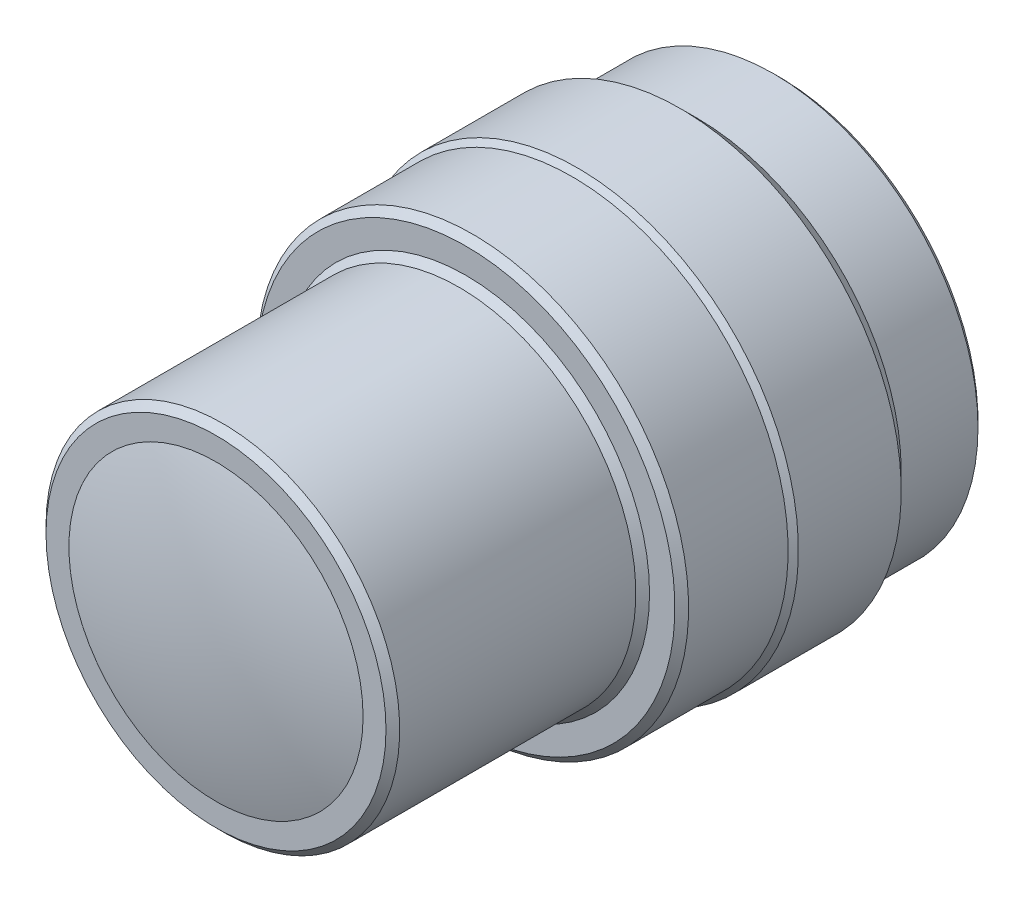
ISO-10303-21;
HEADER;
FILE_DESCRIPTION(('STEP AP214'),'2;1');
FILE_NAME('part.step','',(''),(''),'','','');
FILE_SCHEMA(('AUTOMOTIVE_DESIGN { 1 0 10303 214 1 1 1 1 }'));
ENDSEC;
DATA;
#1=APPLICATION_CONTEXT('core data for automotive mechanical design processes');
#2=APPLICATION_PROTOCOL_DEFINITION('international standard','automotive_design',2000,#1);
#3=PRODUCT_CONTEXT('',#1,'mechanical');
#4=PRODUCT('Part','Part','',(#3));
#5=PRODUCT_RELATED_PRODUCT_CATEGORY('part','',(#4));
#6=PRODUCT_DEFINITION_FORMATION('','',#4);
#7=PRODUCT_DEFINITION_CONTEXT('part definition',#1,'design');
#8=PRODUCT_DEFINITION('design','',#6,#7);
#9=PRODUCT_DEFINITION_SHAPE('','',#8);
#10=(LENGTH_UNIT() NAMED_UNIT(*) SI_UNIT(.MILLI.,.METRE.));
#11=(NAMED_UNIT(*) PLANE_ANGLE_UNIT() SI_UNIT($,.RADIAN.));
#12=(NAMED_UNIT(*) SI_UNIT($,.STERADIAN.) SOLID_ANGLE_UNIT());
#13=UNCERTAINTY_MEASURE_WITH_UNIT(LENGTH_MEASURE(1.E-05),#10,'distance_accuracy_value','');
#14=(GEOMETRIC_REPRESENTATION_CONTEXT(3) GLOBAL_UNCERTAINTY_ASSIGNED_CONTEXT((#13)) GLOBAL_UNIT_ASSIGNED_CONTEXT((#10,
#11,#12)) REPRESENTATION_CONTEXT('',''));
#15=CARTESIAN_POINT('',(0.,0.,0.));
#16=DIRECTION('',(0.,0.,1.));
#17=DIRECTION('',(1.,0.,0.));
#18=AXIS2_PLACEMENT_3D('',#15,#16,#17);
#19=CARTESIAN_POINT('',(0.,0.,0.));
#20=DIRECTION('',(0.,0.,1.));
#21=DIRECTION('',(1.,0.,0.));
#22=AXIS2_PLACEMENT_3D('',#19,#20,#21);
#23=PLANE('',#22);
#24=CARTESIAN_POINT('',(0.,0.,0.));
#25=DIRECTION('',(0.,0.,-1.));
#26=DIRECTION('',(-1.,0.,0.));
#27=AXIS2_PLACEMENT_3D('',#24,#25,#26);
#28=CIRCLE('',#27,12.7);
#29=CARTESIAN_POINT('',(-12.7,0.,0.));
#30=VERTEX_POINT('',#29);
#31=EDGE_CURVE('E10',#30,#30,#28,.T.);
#32=ORIENTED_EDGE('',*,*,#31,.T.);
#33=EDGE_LOOP('',(#32));
#34=FACE_BOUND('',#33,.T.);
#35=ADVANCED_FACE('F36',(#34),#23,.F.);
#36=CARTESIAN_POINT('',(0.,0.,0.));
#37=DIRECTION('',(0.,0.,-1.));
#38=DIRECTION('',(-1.,0.,0.));
#39=AXIS2_PLACEMENT_3D('',#36,#37,#38);
#40=CYLINDRICAL_SURFACE('',#39,12.7);
#41=ORIENTED_EDGE('',*,*,#31,.F.);
#42=EDGE_LOOP('',(#41));
#43=FACE_BOUND('',#42,.T.);
#44=CARTESIAN_POINT('',(0.,0.,3.));
#45=DIRECTION('',(0.,0.,-1.));
#46=DIRECTION('',(-1.,0.,0.));
#47=AXIS2_PLACEMENT_3D('',#44,#45,#46);
#48=CIRCLE('',#47,12.7);
#49=CARTESIAN_POINT('',(-12.7,0.,3.));
#50=VERTEX_POINT('',#49);
#51=EDGE_CURVE('E42',#50,#50,#48,.T.);
#52=ORIENTED_EDGE('',*,*,#51,.T.);
#53=EDGE_LOOP('',(#52));
#54=FACE_BOUND('',#53,.T.);
#55=ADVANCED_FACE('F116',(#43,#54),#40,.T.);
#56=CARTESIAN_POINT('',(12.7,0.,3.));
#57=DIRECTION('',(0.,0.,1.));
#58=DIRECTION('',(1.,0.,0.));
#59=AXIS2_PLACEMENT_3D('',#56,#57,#58);
#60=PLANE('',#59);
#61=ORIENTED_EDGE('',*,*,#51,.F.);
#62=EDGE_LOOP('',(#61));
#63=FACE_BOUND('',#62,.T.);
#64=CARTESIAN_POINT('',(0.,0.,3.));
#65=DIRECTION('',(0.,0.,-1.));
#66=DIRECTION('',(-1.,0.,0.));
#67=AXIS2_PLACEMENT_3D('',#64,#65,#66);
#68=CIRCLE('',#67,15.);
#69=CARTESIAN_POINT('',(-15.,0.,3.));
#70=VERTEX_POINT('',#69);
#71=EDGE_CURVE('E46',#70,#70,#68,.T.);
#72=ORIENTED_EDGE('',*,*,#71,.T.);
#73=EDGE_LOOP('',(#72));
#74=FACE_BOUND('',#73,.T.);
#75=ADVANCED_FACE('F120',(#63,#74),#60,.F.);
#76=CARTESIAN_POINT('',(0.,0.,0.));
#77=DIRECTION('',(0.,0.,-1.));
#78=DIRECTION('',(-1.,0.,0.));
#79=AXIS2_PLACEMENT_3D('',#76,#77,#78);
#80=CYLINDRICAL_SURFACE('',#79,15.);
#81=ORIENTED_EDGE('',*,*,#71,.F.);
#82=EDGE_LOOP('',(#81));
#83=FACE_BOUND('',#82,.T.);
#84=CARTESIAN_POINT('',(0.,0.,4.));
#85=DIRECTION('',(0.,0.,-1.));
#86=DIRECTION('',(-1.,0.,0.));
#87=AXIS2_PLACEMENT_3D('',#84,#85,#86);
#88=CIRCLE('',#87,15.);
#89=CARTESIAN_POINT('',(-15.,0.,4.));
#90=VERTEX_POINT('',#89);
#91=EDGE_CURVE('E50',#90,#90,#88,.T.);
#92=ORIENTED_EDGE('',*,*,#91,.T.);
#93=EDGE_LOOP('',(#92));
#94=FACE_BOUND('',#93,.T.);
#95=ADVANCED_FACE('F125',(#83,#94),#80,.T.);
#96=CARTESIAN_POINT('',(15.,0.,4.));
#97=DIRECTION('',(0.,0.,1.));
#98=DIRECTION('',(1.,0.,0.));
#99=AXIS2_PLACEMENT_3D('',#96,#97,#98);
#100=PLANE('',#99);
#101=ORIENTED_EDGE('',*,*,#91,.F.);
#102=EDGE_LOOP('',(#101));
#103=FACE_BOUND('',#102,.T.);
#104=CARTESIAN_POINT('',(0.,0.,4.));
#105=DIRECTION('',(0.,0.,-1.));
#106=DIRECTION('',(-1.,0.,0.));
#107=AXIS2_PLACEMENT_3D('',#104,#105,#106);
#108=CIRCLE('',#107,29.);
#109=CARTESIAN_POINT('',(-29.,0.,4.));
#110=VERTEX_POINT('',#109);
#111=EDGE_CURVE('E55',#110,#110,#108,.T.);
#112=ORIENTED_EDGE('',*,*,#111,.T.);
#113=EDGE_LOOP('',(#112));
#114=FACE_BOUND('',#113,.T.);
#115=ADVANCED_FACE('F131',(#103,#114),#100,.F.);
#116=CARTESIAN_POINT('',(0.,0.,4.8));
#117=DIRECTION('',(0.,0.,1.));
#118=DIRECTION('',(1.,0.,0.));
#119=AXIS2_PLACEMENT_3D('',#116,#117,#118);
#120=CONICAL_SURFACE('',#119,29.8,0.78539816339745);
#121=ORIENTED_EDGE('',*,*,#111,.F.);
#122=EDGE_LOOP('',(#121));
#123=FACE_BOUND('',#122,.T.);
#124=CARTESIAN_POINT('',(0.,0.,4.8));
#125=DIRECTION('',(0.,0.,-1.));
#126=DIRECTION('',(-1.,0.,0.));
#127=AXIS2_PLACEMENT_3D('',#124,#125,#126);
#128=CIRCLE('',#127,29.8);
#129=CARTESIAN_POINT('',(-29.8,0.,4.8));
#130=VERTEX_POINT('',#129);
#131=EDGE_CURVE('E58',#130,#130,#128,.T.);
#132=ORIENTED_EDGE('',*,*,#131,.T.);
#133=EDGE_LOOP('',(#132));
#134=FACE_BOUND('',#133,.T.);
#135=ADVANCED_FACE('F135',(#123,#134),#120,.T.);
#136=CARTESIAN_POINT('',(0.,0.,0.));
#137=DIRECTION('',(0.,0.,-1.));
#138=DIRECTION('',(-1.,0.,0.));
#139=AXIS2_PLACEMENT_3D('',#136,#137,#138);
#140=CYLINDRICAL_SURFACE('',#139,29.8);
#141=ORIENTED_EDGE('',*,*,#131,.F.);
#142=EDGE_LOOP('',(#141));
#143=FACE_BOUND('',#142,.T.);
#144=CARTESIAN_POINT('',(0.,0.,16.));
#145=DIRECTION('',(0.,0.,-1.));
#146=DIRECTION('',(-1.,0.,0.));
#147=AXIS2_PLACEMENT_3D('',#144,#145,#146);
#148=CIRCLE('',#147,29.8);
#149=CARTESIAN_POINT('',(-29.8,0.,16.));
#150=VERTEX_POINT('',#149);
#151=EDGE_CURVE('E61',#150,#150,#148,.T.);
#152=ORIENTED_EDGE('',*,*,#151,.T.);
#153=EDGE_LOOP('',(#152));
#154=FACE_BOUND('',#153,.T.);
#155=ADVANCED_FACE('F139',(#143,#154),#140,.T.);
#156=CARTESIAN_POINT('',(0.,0.,18.45));
#157=DIRECTION('',(0.,0.,1.));
#158=DIRECTION('',(1.,0.,0.));
#159=AXIS2_PLACEMENT_3D('',#156,#157,#158);
#160=CONICAL_SURFACE('',#159,32.25,0.78539816339745);
#161=ORIENTED_EDGE('',*,*,#151,.F.);
#162=EDGE_LOOP('',(#161));
#163=FACE_BOUND('',#162,.T.);
#164=CARTESIAN_POINT('',(0.,0.,18.45));
#165=DIRECTION('',(0.,0.,-1.));
#166=DIRECTION('',(-1.,0.,0.));
#167=AXIS2_PLACEMENT_3D('',#164,#165,#166);
#168=CIRCLE('',#167,32.25);
#169=CARTESIAN_POINT('',(-32.25,0.,18.45));
#170=VERTEX_POINT('',#169);
#171=EDGE_CURVE('E64',#170,#170,#168,.T.);
#172=ORIENTED_EDGE('',*,*,#171,.T.);
#173=EDGE_LOOP('',(#172));
#174=FACE_BOUND('',#173,.T.);
#175=ADVANCED_FACE('F143',(#163,#174),#160,.T.);
#176=CARTESIAN_POINT('',(0.,0.,0.));
#177=DIRECTION('',(0.,0.,-1.));
#178=DIRECTION('',(-1.,0.,0.));
#179=AXIS2_PLACEMENT_3D('',#176,#177,#178);
#180=CYLINDRICAL_SURFACE('',#179,32.25);
#181=ORIENTED_EDGE('',*,*,#171,.F.);
#182=EDGE_LOOP('',(#181));
#183=FACE_BOUND('',#182,.T.);
#184=CARTESIAN_POINT('',(0.,0.,33.45));
#185=DIRECTION('',(0.,0.,-1.));
#186=DIRECTION('',(-1.,0.,0.));
#187=AXIS2_PLACEMENT_3D('',#184,#185,#186);
#188=CIRCLE('',#187,32.25);
#189=CARTESIAN_POINT('',(-32.25,0.,33.45));
#190=VERTEX_POINT('',#189);
#191=EDGE_CURVE('E67',#190,#190,#188,.T.);
#192=ORIENTED_EDGE('',*,*,#191,.T.);
#193=EDGE_LOOP('',(#192));
#194=FACE_BOUND('',#193,.T.);
#195=ADVANCED_FACE('F147',(#183,#194),#180,.T.);
#196=CARTESIAN_POINT('',(0.,0.,34.2));
#197=DIRECTION('',(0.,0.,-1.));
#198=DIRECTION('',(-1.,0.,0.));
#199=AXIS2_PLACEMENT_3D('',#196,#197,#198);
#200=CONICAL_SURFACE('',#199,31.5,0.785398163397448);
#201=ORIENTED_EDGE('',*,*,#191,.F.);
#202=EDGE_LOOP('',(#201));
#203=FACE_BOUND('',#202,.T.);
#204=CARTESIAN_POINT('',(0.,0.,34.2));
#205=DIRECTION('',(0.,0.,-1.));
#206=DIRECTION('',(-1.,0.,0.));
#207=AXIS2_PLACEMENT_3D('',#204,#205,#206);
#208=CIRCLE('',#207,31.5);
#209=CARTESIAN_POINT('',(-31.5,0.,34.2));
#210=VERTEX_POINT('',#209);
#211=EDGE_CURVE('E70',#210,#210,#208,.T.);
#212=ORIENTED_EDGE('',*,*,#211,.T.);
#213=EDGE_LOOP('',(#212));
#214=FACE_BOUND('',#213,.T.);
#215=ADVANCED_FACE('F151',(#203,#214),#200,.T.);
#216=CARTESIAN_POINT('',(0.,0.,0.));
#217=DIRECTION('',(0.,0.,-1.));
#218=DIRECTION('',(-1.,0.,0.));
#219=AXIS2_PLACEMENT_3D('',#216,#217,#218);
#220=CYLINDRICAL_SURFACE('',#219,31.5);
#221=ORIENTED_EDGE('',*,*,#211,.F.);
#222=EDGE_LOOP('',(#221));
#223=FACE_BOUND('',#222,.T.);
#224=CARTESIAN_POINT('',(0.,0.,48.72));
#225=DIRECTION('',(0.,0.,-1.));
#226=DIRECTION('',(-1.,0.,0.));
#227=AXIS2_PLACEMENT_3D('',#224,#225,#226);
#228=CIRCLE('',#227,31.5);
#229=CARTESIAN_POINT('',(-31.5,0.,48.72));
#230=VERTEX_POINT('',#229);
#231=EDGE_CURVE('E73',#230,#230,#228,.T.);
#232=ORIENTED_EDGE('',*,*,#231,.T.);
#233=EDGE_LOOP('',(#232));
#234=FACE_BOUND('',#233,.T.);
#235=ADVANCED_FACE('F155',(#223,#234),#220,.T.);
#236=CARTESIAN_POINT('',(0.,0.,49.72));
#237=DIRECTION('',(0.,0.,-1.));
#238=DIRECTION('',(-1.,0.,0.));
#239=AXIS2_PLACEMENT_3D('',#236,#237,#238);
#240=CONICAL_SURFACE('',#239,30.5,0.785398163397436);
#241=ORIENTED_EDGE('',*,*,#231,.F.);
#242=EDGE_LOOP('',(#241));
#243=FACE_BOUND('',#242,.T.);
#244=CARTESIAN_POINT('',(0.,0.,49.72));
#245=DIRECTION('',(0.,0.,-1.));
#246=DIRECTION('',(-1.,0.,0.));
#247=AXIS2_PLACEMENT_3D('',#244,#245,#246);
#248=CIRCLE('',#247,30.5);
#249=CARTESIAN_POINT('',(-30.5,0.,49.72));
#250=VERTEX_POINT('',#249);
#251=EDGE_CURVE('E76',#250,#250,#248,.T.);
#252=ORIENTED_EDGE('',*,*,#251,.T.);
#253=EDGE_LOOP('',(#252));
#254=FACE_BOUND('',#253,.T.);
#255=ADVANCED_FACE('F159',(#243,#254),#240,.T.);
#256=CARTESIAN_POINT('',(30.5,0.,49.72));
#257=DIRECTION('',(0.,0.,-1.));
#258=DIRECTION('',(-1.,0.,0.));
#259=AXIS2_PLACEMENT_3D('',#256,#257,#258);
#260=PLANE('',#259);
#261=ORIENTED_EDGE('',*,*,#251,.F.);
#262=EDGE_LOOP('',(#261));
#263=FACE_BOUND('',#262,.T.);
#264=CARTESIAN_POINT('',(0.,0.,49.72));
#265=DIRECTION('',(0.,0.,-1.));
#266=DIRECTION('',(-1.,0.,0.));
#267=AXIS2_PLACEMENT_3D('',#264,#265,#266);
#268=CIRCLE('',#267,26.8);
#269=CARTESIAN_POINT('',(-26.8,0.,49.72));
#270=VERTEX_POINT('',#269);
#271=EDGE_CURVE('E79',#270,#270,#268,.T.);
#272=ORIENTED_EDGE('',*,*,#271,.T.);
#273=EDGE_LOOP('',(#272));
#274=FACE_BOUND('',#273,.T.);
#275=ADVANCED_FACE('F163',(#263,#274),#260,.F.);
#276=CARTESIAN_POINT('',(0.,0.,50.72));
#277=DIRECTION('',(0.,0.,-1.));
#278=DIRECTION('',(-1.,0.,0.));
#279=AXIS2_PLACEMENT_3D('',#276,#277,#278);
#280=CONICAL_SURFACE('',#279,25.8,0.785398163397434);
#281=ORIENTED_EDGE('',*,*,#271,.F.);
#282=EDGE_LOOP('',(#281));
#283=FACE_BOUND('',#282,.T.);
#284=CARTESIAN_POINT('',(0.,0.,50.72));
#285=DIRECTION('',(0.,0.,-1.));
#286=DIRECTION('',(-1.,0.,0.));
#287=AXIS2_PLACEMENT_3D('',#284,#285,#286);
#288=CIRCLE('',#287,25.8);
#289=CARTESIAN_POINT('',(-25.8,0.,50.72));
#290=VERTEX_POINT('',#289);
#291=EDGE_CURVE('E82',#290,#290,#288,.T.);
#292=ORIENTED_EDGE('',*,*,#291,.T.);
#293=EDGE_LOOP('',(#292));
#294=FACE_BOUND('',#293,.T.);
#295=ADVANCED_FACE('F111',(#283,#294),#280,.T.);
#296=CARTESIAN_POINT('',(0.,0.,0.));
#297=DIRECTION('',(0.,0.,-1.));
#298=DIRECTION('',(-1.,0.,0.));
#299=AXIS2_PLACEMENT_3D('',#296,#297,#298);
#300=CYLINDRICAL_SURFACE('',#299,25.8);
#301=ORIENTED_EDGE('',*,*,#291,.F.);
#302=EDGE_LOOP('',(#301));
#303=FACE_BOUND('',#302,.T.);
#304=CARTESIAN_POINT('',(0.,0.,85.17));
#305=DIRECTION('',(0.,0.,-1.));
#306=DIRECTION('',(-1.,0.,0.));
#307=AXIS2_PLACEMENT_3D('',#304,#305,#306);
#308=CIRCLE('',#307,25.8);
#309=CARTESIAN_POINT('',(-25.8,0.,85.17));
#310=VERTEX_POINT('',#309);
#311=EDGE_CURVE('E85',#310,#310,#308,.T.);
#312=ORIENTED_EDGE('',*,*,#311,.T.);
#313=EDGE_LOOP('',(#312));
#314=FACE_BOUND('',#313,.T.);
#315=ADVANCED_FACE('F105',(#303,#314),#300,.T.);
#316=CARTESIAN_POINT('',(0.,0.,86.17));
#317=DIRECTION('',(0.,0.,-1.));
#318=DIRECTION('',(-1.,0.,0.));
#319=AXIS2_PLACEMENT_3D('',#316,#317,#318);
#320=CONICAL_SURFACE('',#319,24.8,0.78539816339745);
#321=ORIENTED_EDGE('',*,*,#311,.F.);
#322=EDGE_LOOP('',(#321));
#323=FACE_BOUND('',#322,.T.);
#324=CARTESIAN_POINT('',(0.,0.,86.17));
#325=DIRECTION('',(0.,0.,-1.));
#326=DIRECTION('',(-1.,0.,0.));
#327=AXIS2_PLACEMENT_3D('',#324,#325,#326);
#328=CIRCLE('',#327,24.8);
#329=CARTESIAN_POINT('',(-24.8,0.,86.17));
#330=VERTEX_POINT('',#329);
#331=EDGE_CURVE('E88',#330,#330,#328,.T.);
#332=ORIENTED_EDGE('',*,*,#331,.T.);
#333=EDGE_LOOP('',(#332));
#334=FACE_BOUND('',#333,.T.);
#335=ADVANCED_FACE('F100',(#323,#334),#320,.T.);
#336=CARTESIAN_POINT('',(24.8,0.,86.17));
#337=DIRECTION('',(0.,0.,-1.));
#338=DIRECTION('',(-1.,0.,0.));
#339=AXIS2_PLACEMENT_3D('',#336,#337,#338);
#340=PLANE('',#339);
#341=CARTESIAN_POINT('',(0.,0.,86.17));
#342=DIRECTION('',(0.,0.,1.));
#343=DIRECTION('',(1.,0.,0.));
#344=AXIS2_PLACEMENT_3D('',#341,#342,#343);
#345=CIRCLE('',#344,21.4593996015979);
#346=CARTESIAN_POINT('',(21.4593996015979,0.,86.17));
#347=VERTEX_POINT('',#346);
#348=EDGE_CURVE('E91',#347,#347,#345,.T.);
#349=ORIENTED_EDGE('',*,*,#348,.F.);
#350=EDGE_LOOP('',(#349));
#351=FACE_BOUND('',#350,.T.);
#352=ORIENTED_EDGE('',*,*,#331,.F.);
#353=EDGE_LOOP('',(#352));
#354=FACE_BOUND('',#353,.T.);
#355=ADVANCED_FACE('F97',(#351,#354),#340,.F.);
#356=CARTESIAN_POINT('',(0.,0.,10.9190281231571));
#357=DIRECTION('',(0.,0.,1.));
#358=DIRECTION('',(1.,0.,0.));
#359=AXIS2_PLACEMENT_3D('',#356,#357,#358);
#360=SPHERICAL_SURFACE('',#359,78.2509718768429);
#361=ORIENTED_EDGE('',*,*,#348,.T.);
#362=EDGE_LOOP('',(#361));
#363=FACE_BOUND('',#362,.T.);
#364=ADVANCED_FACE('F95',(#363),#360,.T.);
#365=CLOSED_SHELL('',(#35,#55,#75,#95,#115,#135,#155,#175,#195,#215,#235,#255,#275,#295,#315,
#335,#355,#364));
#366=MANIFOLD_SOLID_BREP('B2',#365);
#367=ADVANCED_BREP_SHAPE_REPRESENTATION('',(#18,#366),#14);
#368=SHAPE_DEFINITION_REPRESENTATION(#9,#367);
ENDSEC;
END-ISO-10303-21;
